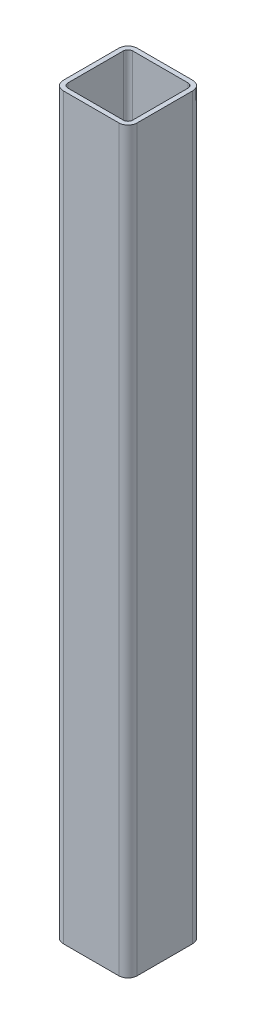
ISO-10303-21;
HEADER;
FILE_DESCRIPTION(('STEP AP214'),'2;1');
FILE_NAME('part.step','',(''),(''),'','','');
FILE_SCHEMA(('AUTOMOTIVE_DESIGN { 1 0 10303 214 1 1 1 1 }'));
ENDSEC;
DATA;
#1=APPLICATION_CONTEXT('core data for automotive mechanical design processes');
#2=APPLICATION_PROTOCOL_DEFINITION('international standard','automotive_design',2000,#1);
#3=PRODUCT_CONTEXT('',#1,'mechanical');
#4=PRODUCT('Part','Part','',(#3));
#5=PRODUCT_RELATED_PRODUCT_CATEGORY('part','',(#4));
#6=PRODUCT_DEFINITION_FORMATION('','',#4);
#7=PRODUCT_DEFINITION_CONTEXT('part definition',#1,'design');
#8=PRODUCT_DEFINITION('design','',#6,#7);
#9=PRODUCT_DEFINITION_SHAPE('','',#8);
#10=(LENGTH_UNIT() NAMED_UNIT(*) SI_UNIT(.MILLI.,.METRE.));
#11=(NAMED_UNIT(*) PLANE_ANGLE_UNIT() SI_UNIT($,.RADIAN.));
#12=(NAMED_UNIT(*) SI_UNIT($,.STERADIAN.) SOLID_ANGLE_UNIT());
#13=UNCERTAINTY_MEASURE_WITH_UNIT(LENGTH_MEASURE(1.E-05),#10,'distance_accuracy_value','');
#14=(GEOMETRIC_REPRESENTATION_CONTEXT(3) GLOBAL_UNCERTAINTY_ASSIGNED_CONTEXT((#13)) GLOBAL_UNIT_ASSIGNED_CONTEXT((#10,
#11,#12)) REPRESENTATION_CONTEXT('',''));
#15=CARTESIAN_POINT('',(0.,0.,0.));
#16=DIRECTION('',(0.,0.,1.));
#17=DIRECTION('',(1.,0.,0.));
#18=AXIS2_PLACEMENT_3D('',#15,#16,#17);
#19=CARTESIAN_POINT('',(-30.,800.,30.));
#20=DIRECTION('',(0.,-1.,0.));
#21=DIRECTION('',(0.,0.,-1.));
#22=AXIS2_PLACEMENT_3D('',#19,#20,#21);
#23=CYLINDRICAL_SURFACE('',#22,10.);
#24=CARTESIAN_POINT('',(-30.,0.,30.));
#25=DIRECTION('',(0.,1.,0.));
#26=DIRECTION('',(0.,0.,1.));
#27=AXIS2_PLACEMENT_3D('',#24,#25,#26);
#28=CIRCLE('',#27,10.);
#29=CARTESIAN_POINT('',(-40.,0.,30.));
#30=VERTEX_POINT('',#29);
#31=CARTESIAN_POINT('',(-30.,0.,40.));
#32=VERTEX_POINT('',#31);
#33=EDGE_CURVE('E239',#30,#32,#28,.T.);
#34=ORIENTED_EDGE('',*,*,#33,.T.);
#35=DIRECTION('',(0.,-1.,0.));
#36=VECTOR('',#35,1.);
#37=CARTESIAN_POINT('',(-30.,800.,40.));
#38=LINE('',#37,#36);
#39=CARTESIAN_POINT('',(-30.,800.,40.));
#40=VERTEX_POINT('',#39);
#41=EDGE_CURVE('E12',#40,#32,#38,.T.);
#42=ORIENTED_EDGE('',*,*,#41,.F.);
#43=CARTESIAN_POINT('',(-30.,800.,30.));
#44=DIRECTION('',(0.,1.,0.));
#45=DIRECTION('',(0.,0.,1.));
#46=AXIS2_PLACEMENT_3D('',#43,#44,#45);
#47=CIRCLE('',#46,10.);
#48=CARTESIAN_POINT('',(-40.,800.,30.));
#49=VERTEX_POINT('',#48);
#50=EDGE_CURVE('E320',#49,#40,#47,.T.);
#51=ORIENTED_EDGE('',*,*,#50,.F.);
#52=DIRECTION('',(0.,-1.,0.));
#53=VECTOR('',#52,1.);
#54=CARTESIAN_POINT('',(-40.,800.,30.));
#55=LINE('',#54,#53);
#56=EDGE_CURVE('E255',#49,#30,#55,.T.);
#57=ORIENTED_EDGE('',*,*,#56,.T.);
#58=EDGE_LOOP('',(#34,#42,#51,#57));
#59=FACE_BOUND('',#58,.T.);
#60=ADVANCED_FACE('F70',(#59),#23,.T.);
#61=CARTESIAN_POINT('',(-30.,800.,40.));
#62=DIRECTION('',(0.,0.,-1.));
#63=DIRECTION('',(-1.,0.,0.));
#64=AXIS2_PLACEMENT_3D('',#61,#62,#63);
#65=PLANE('',#64);
#66=DIRECTION('',(1.,0.,0.));
#67=VECTOR('',#66,1.);
#68=CARTESIAN_POINT('',(-30.,0.,40.));
#69=LINE('',#68,#67);
#70=CARTESIAN_POINT('',(30.,0.,40.));
#71=VERTEX_POINT('',#70);
#72=EDGE_CURVE('E245',#32,#71,#69,.T.);
#73=ORIENTED_EDGE('',*,*,#72,.T.);
#74=DIRECTION('',(0.,-1.,0.));
#75=VECTOR('',#74,1.);
#76=CARTESIAN_POINT('',(30.,800.,40.));
#77=LINE('',#76,#75);
#78=CARTESIAN_POINT('',(30.,800.,40.));
#79=VERTEX_POINT('',#78);
#80=EDGE_CURVE('E80',#79,#71,#77,.T.);
#81=ORIENTED_EDGE('',*,*,#80,.F.);
#82=DIRECTION('',(1.,0.,0.));
#83=VECTOR('',#82,1.);
#84=CARTESIAN_POINT('',(-30.,800.,40.));
#85=LINE('',#84,#83);
#86=EDGE_CURVE('E317',#40,#79,#85,.T.);
#87=ORIENTED_EDGE('',*,*,#86,.F.);
#88=ORIENTED_EDGE('',*,*,#41,.T.);
#89=EDGE_LOOP('',(#73,#81,#87,#88));
#90=FACE_BOUND('',#89,.T.);
#91=ADVANCED_FACE('F351',(#90),#65,.F.);
#92=CARTESIAN_POINT('',(30.,800.,30.));
#93=DIRECTION('',(0.,-1.,0.));
#94=DIRECTION('',(0.,0.,-1.));
#95=AXIS2_PLACEMENT_3D('',#92,#93,#94);
#96=CYLINDRICAL_SURFACE('',#95,10.);
#97=CARTESIAN_POINT('',(30.,0.,30.));
#98=DIRECTION('',(0.,1.,0.));
#99=DIRECTION('',(0.,0.,1.));
#100=AXIS2_PLACEMENT_3D('',#97,#98,#99);
#101=CIRCLE('',#100,10.);
#102=CARTESIAN_POINT('',(40.,0.,30.));
#103=VERTEX_POINT('',#102);
#104=EDGE_CURVE('E241',#71,#103,#101,.T.);
#105=ORIENTED_EDGE('',*,*,#104,.T.);
#106=DIRECTION('',(0.,-1.,0.));
#107=VECTOR('',#106,1.);
#108=CARTESIAN_POINT('',(40.,800.,30.));
#109=LINE('',#108,#107);
#110=CARTESIAN_POINT('',(40.,800.,30.));
#111=VERTEX_POINT('',#110);
#112=EDGE_CURVE('E261',#111,#103,#109,.T.);
#113=ORIENTED_EDGE('',*,*,#112,.F.);
#114=CARTESIAN_POINT('',(30.,800.,30.));
#115=DIRECTION('',(0.,1.,0.));
#116=DIRECTION('',(0.,0.,1.));
#117=AXIS2_PLACEMENT_3D('',#114,#115,#116);
#118=CIRCLE('',#117,10.);
#119=EDGE_CURVE('E321',#79,#111,#118,.T.);
#120=ORIENTED_EDGE('',*,*,#119,.F.);
#121=ORIENTED_EDGE('',*,*,#80,.T.);
#122=EDGE_LOOP('',(#105,#113,#120,#121));
#123=FACE_BOUND('',#122,.T.);
#124=ADVANCED_FACE('F358',(#123),#96,.T.);
#125=CARTESIAN_POINT('',(40.,800.,-30.));
#126=DIRECTION('',(-1.,0.,0.));
#127=DIRECTION('',(0.,0.,1.));
#128=AXIS2_PLACEMENT_3D('',#125,#126,#127);
#129=PLANE('',#128);
#130=DIRECTION('',(0.,0.,-1.));
#131=VECTOR('',#130,1.);
#132=CARTESIAN_POINT('',(40.,0.,-30.));
#133=LINE('',#132,#131);
#134=CARTESIAN_POINT('',(40.,0.,-30.));
#135=VERTEX_POINT('',#134);
#136=EDGE_CURVE('E246',#103,#135,#133,.T.);
#137=ORIENTED_EDGE('',*,*,#136,.T.);
#138=DIRECTION('',(0.,-1.,0.));
#139=VECTOR('',#138,1.);
#140=CARTESIAN_POINT('',(40.,800.,-30.));
#141=LINE('',#140,#139);
#142=CARTESIAN_POINT('',(40.,800.,-30.));
#143=VERTEX_POINT('',#142);
#144=EDGE_CURVE('E256',#143,#135,#141,.T.);
#145=ORIENTED_EDGE('',*,*,#144,.F.);
#146=DIRECTION('',(0.,0.,-1.));
#147=VECTOR('',#146,1.);
#148=CARTESIAN_POINT('',(40.,800.,-30.));
#149=LINE('',#148,#147);
#150=EDGE_CURVE('E323',#111,#143,#149,.T.);
#151=ORIENTED_EDGE('',*,*,#150,.F.);
#152=ORIENTED_EDGE('',*,*,#112,.T.);
#153=EDGE_LOOP('',(#137,#145,#151,#152));
#154=FACE_BOUND('',#153,.T.);
#155=ADVANCED_FACE('F328',(#154),#129,.F.);
#156=CARTESIAN_POINT('',(30.,800.,-30.));
#157=DIRECTION('',(0.,-1.,0.));
#158=DIRECTION('',(0.,0.,-1.));
#159=AXIS2_PLACEMENT_3D('',#156,#157,#158);
#160=CYLINDRICAL_SURFACE('',#159,10.);
#161=CARTESIAN_POINT('',(30.,0.,-30.));
#162=DIRECTION('',(0.,1.,0.));
#163=DIRECTION('',(0.,0.,1.));
#164=AXIS2_PLACEMENT_3D('',#161,#162,#163);
#165=CIRCLE('',#164,10.);
#166=CARTESIAN_POINT('',(30.,0.,-40.));
#167=VERTEX_POINT('',#166);
#168=EDGE_CURVE('E247',#135,#167,#165,.T.);
#169=ORIENTED_EDGE('',*,*,#168,.T.);
#170=DIRECTION('',(0.,-1.,0.));
#171=VECTOR('',#170,1.);
#172=CARTESIAN_POINT('',(30.,800.,-40.));
#173=LINE('',#172,#171);
#174=CARTESIAN_POINT('',(30.,800.,-40.));
#175=VERTEX_POINT('',#174);
#176=EDGE_CURVE('E206',#175,#167,#173,.T.);
#177=ORIENTED_EDGE('',*,*,#176,.F.);
#178=CARTESIAN_POINT('',(30.,800.,-30.));
#179=DIRECTION('',(0.,1.,0.));
#180=DIRECTION('',(0.,0.,1.));
#181=AXIS2_PLACEMENT_3D('',#178,#179,#180);
#182=CIRCLE('',#181,10.);
#183=EDGE_CURVE('E197',#143,#175,#182,.T.);
#184=ORIENTED_EDGE('',*,*,#183,.F.);
#185=ORIENTED_EDGE('',*,*,#144,.T.);
#186=EDGE_LOOP('',(#169,#177,#184,#185));
#187=FACE_BOUND('',#186,.T.);
#188=ADVANCED_FACE('F334',(#187),#160,.T.);
#189=CARTESIAN_POINT('',(30.,800.,-40.));
#190=DIRECTION('',(0.,0.,1.));
#191=DIRECTION('',(1.,0.,0.));
#192=AXIS2_PLACEMENT_3D('',#189,#190,#191);
#193=PLANE('',#192);
#194=DIRECTION('',(-1.,0.,0.));
#195=VECTOR('',#194,1.);
#196=CARTESIAN_POINT('',(30.,0.,-40.));
#197=LINE('',#196,#195);
#198=CARTESIAN_POINT('',(-30.,0.,-40.));
#199=VERTEX_POINT('',#198);
#200=EDGE_CURVE('E202',#167,#199,#197,.T.);
#201=ORIENTED_EDGE('',*,*,#200,.T.);
#202=DIRECTION('',(0.,-1.,0.));
#203=VECTOR('',#202,1.);
#204=CARTESIAN_POINT('',(-30.,800.,-40.));
#205=LINE('',#204,#203);
#206=CARTESIAN_POINT('',(-30.,800.,-40.));
#207=VERTEX_POINT('',#206);
#208=EDGE_CURVE('E205',#207,#199,#205,.T.);
#209=ORIENTED_EDGE('',*,*,#208,.F.);
#210=DIRECTION('',(-1.,0.,0.));
#211=VECTOR('',#210,1.);
#212=CARTESIAN_POINT('',(30.,800.,-40.));
#213=LINE('',#212,#211);
#214=EDGE_CURVE('E191',#175,#207,#213,.T.);
#215=ORIENTED_EDGE('',*,*,#214,.F.);
#216=ORIENTED_EDGE('',*,*,#176,.T.);
#217=EDGE_LOOP('',(#201,#209,#215,#216));
#218=FACE_BOUND('',#217,.T.);
#219=ADVANCED_FACE('F201',(#218),#193,.F.);
#220=CARTESIAN_POINT('',(-30.,800.,-30.));
#221=DIRECTION('',(0.,-1.,0.));
#222=DIRECTION('',(0.,0.,-1.));
#223=AXIS2_PLACEMENT_3D('',#220,#221,#222);
#224=CYLINDRICAL_SURFACE('',#223,10.);
#225=CARTESIAN_POINT('',(-30.,0.,-30.));
#226=DIRECTION('',(0.,1.,0.));
#227=DIRECTION('',(0.,0.,1.));
#228=AXIS2_PLACEMENT_3D('',#225,#226,#227);
#229=CIRCLE('',#228,10.);
#230=CARTESIAN_POINT('',(-40.,0.,-30.));
#231=VERTEX_POINT('',#230);
#232=EDGE_CURVE('E138',#199,#231,#229,.T.);
#233=ORIENTED_EDGE('',*,*,#232,.T.);
#234=DIRECTION('',(0.,-1.,0.));
#235=VECTOR('',#234,1.);
#236=CARTESIAN_POINT('',(-40.,800.,-30.));
#237=LINE('',#236,#235);
#238=CARTESIAN_POINT('',(-40.,800.,-30.));
#239=VERTEX_POINT('',#238);
#240=EDGE_CURVE('E210',#239,#231,#237,.T.);
#241=ORIENTED_EDGE('',*,*,#240,.F.);
#242=CARTESIAN_POINT('',(-30.,800.,-30.));
#243=DIRECTION('',(0.,1.,0.));
#244=DIRECTION('',(0.,0.,1.));
#245=AXIS2_PLACEMENT_3D('',#242,#243,#244);
#246=CIRCLE('',#245,10.);
#247=EDGE_CURVE('E194',#207,#239,#246,.T.);
#248=ORIENTED_EDGE('',*,*,#247,.F.);
#249=ORIENTED_EDGE('',*,*,#208,.T.);
#250=EDGE_LOOP('',(#233,#241,#248,#249));
#251=FACE_BOUND('',#250,.T.);
#252=ADVANCED_FACE('F207',(#251),#224,.T.);
#253=CARTESIAN_POINT('',(30.,800.,30.));
#254=DIRECTION('',(0.,-1.,0.));
#255=DIRECTION('',(0.,0.,-1.));
#256=AXIS2_PLACEMENT_3D('',#253,#254,#255);
#257=CYLINDRICAL_SURFACE('',#256,5.);
#258=CARTESIAN_POINT('',(30.,0.,30.));
#259=DIRECTION('',(0.,1.,0.));
#260=DIRECTION('',(0.,0.,1.));
#261=AXIS2_PLACEMENT_3D('',#258,#259,#260);
#262=CIRCLE('',#261,5.);
#263=CARTESIAN_POINT('',(30.,0.,35.));
#264=VERTEX_POINT('',#263);
#265=CARTESIAN_POINT('',(35.,0.,30.));
#266=VERTEX_POINT('',#265);
#267=EDGE_CURVE('E214',#264,#266,#262,.T.);
#268=ORIENTED_EDGE('',*,*,#267,.F.);
#269=DIRECTION('',(0.,-1.,0.));
#270=VECTOR('',#269,1.);
#271=CARTESIAN_POINT('',(30.,800.,35.));
#272=LINE('',#271,#270);
#273=CARTESIAN_POINT('',(30.,800.,35.));
#274=VERTEX_POINT('',#273);
#275=EDGE_CURVE('E72',#274,#264,#272,.T.);
#276=ORIENTED_EDGE('',*,*,#275,.F.);
#277=CARTESIAN_POINT('',(30.,800.,30.));
#278=DIRECTION('',(0.,1.,0.));
#279=DIRECTION('',(0.,0.,1.));
#280=AXIS2_PLACEMENT_3D('',#277,#278,#279);
#281=CIRCLE('',#280,5.);
#282=CARTESIAN_POINT('',(35.,800.,30.));
#283=VERTEX_POINT('',#282);
#284=EDGE_CURVE('E251',#274,#283,#281,.T.);
#285=ORIENTED_EDGE('',*,*,#284,.T.);
#286=DIRECTION('',(0.,-1.,0.));
#287=VECTOR('',#286,1.);
#288=CARTESIAN_POINT('',(35.,800.,30.));
#289=LINE('',#288,#287);
#290=EDGE_CURVE('E211',#283,#266,#289,.T.);
#291=ORIENTED_EDGE('',*,*,#290,.T.);
#292=EDGE_LOOP('',(#268,#276,#285,#291));
#293=FACE_BOUND('',#292,.T.);
#294=ADVANCED_FACE('F68',(#293),#257,.F.);
#295=CARTESIAN_POINT('',(-30.,800.,35.));
#296=DIRECTION('',(0.,0.,-1.));
#297=DIRECTION('',(-1.,0.,0.));
#298=AXIS2_PLACEMENT_3D('',#295,#296,#297);
#299=PLANE('',#298);
#300=DIRECTION('',(1.,0.,0.));
#301=VECTOR('',#300,1.);
#302=CARTESIAN_POINT('',(-30.,0.,35.));
#303=LINE('',#302,#301);
#304=CARTESIAN_POINT('',(-30.,0.,35.));
#305=VERTEX_POINT('',#304);
#306=EDGE_CURVE('E217',#305,#264,#303,.T.);
#307=ORIENTED_EDGE('',*,*,#306,.F.);
#308=DIRECTION('',(0.,-1.,0.));
#309=VECTOR('',#308,1.);
#310=CARTESIAN_POINT('',(-30.,800.,35.));
#311=LINE('',#310,#309);
#312=CARTESIAN_POINT('',(-30.,800.,35.));
#313=VERTEX_POINT('',#312);
#314=EDGE_CURVE('E277',#313,#305,#311,.T.);
#315=ORIENTED_EDGE('',*,*,#314,.F.);
#316=DIRECTION('',(1.,0.,0.));
#317=VECTOR('',#316,1.);
#318=CARTESIAN_POINT('',(-30.,800.,35.));
#319=LINE('',#318,#317);
#320=EDGE_CURVE('E283',#313,#274,#319,.T.);
#321=ORIENTED_EDGE('',*,*,#320,.T.);
#322=ORIENTED_EDGE('',*,*,#275,.T.);
#323=EDGE_LOOP('',(#307,#315,#321,#322));
#324=FACE_BOUND('',#323,.T.);
#325=ADVANCED_FACE('F284',(#324),#299,.T.);
#326=CARTESIAN_POINT('',(-30.,800.,30.));
#327=DIRECTION('',(0.,-1.,0.));
#328=DIRECTION('',(0.,0.,-1.));
#329=AXIS2_PLACEMENT_3D('',#326,#327,#328);
#330=CYLINDRICAL_SURFACE('',#329,5.);
#331=CARTESIAN_POINT('',(-30.,0.,30.));
#332=DIRECTION('',(0.,1.,0.));
#333=DIRECTION('',(0.,0.,1.));
#334=AXIS2_PLACEMENT_3D('',#331,#332,#333);
#335=CIRCLE('',#334,5.);
#336=CARTESIAN_POINT('',(-35.,0.,30.));
#337=VERTEX_POINT('',#336);
#338=EDGE_CURVE('E222',#337,#305,#335,.T.);
#339=ORIENTED_EDGE('',*,*,#338,.F.);
#340=DIRECTION('',(0.,-1.,0.));
#341=VECTOR('',#340,1.);
#342=CARTESIAN_POINT('',(-35.,800.,30.));
#343=LINE('',#342,#341);
#344=CARTESIAN_POINT('',(-35.,800.,30.));
#345=VERTEX_POINT('',#344);
#346=EDGE_CURVE('E274',#345,#337,#343,.T.);
#347=ORIENTED_EDGE('',*,*,#346,.F.);
#348=CARTESIAN_POINT('',(-30.,800.,30.));
#349=DIRECTION('',(0.,1.,0.));
#350=DIRECTION('',(0.,0.,1.));
#351=AXIS2_PLACEMENT_3D('',#348,#349,#350);
#352=CIRCLE('',#351,5.);
#353=EDGE_CURVE('E291',#345,#313,#352,.T.);
#354=ORIENTED_EDGE('',*,*,#353,.T.);
#355=ORIENTED_EDGE('',*,*,#314,.T.);
#356=EDGE_LOOP('',(#339,#347,#354,#355));
#357=FACE_BOUND('',#356,.T.);
#358=ADVANCED_FACE('F292',(#357),#330,.F.);
#359=CARTESIAN_POINT('',(-35.,800.,30.));
#360=DIRECTION('',(1.,0.,0.));
#361=DIRECTION('',(0.,0.,-1.));
#362=AXIS2_PLACEMENT_3D('',#359,#360,#361);
#363=PLANE('',#362);
#364=DIRECTION('',(0.,0.,1.));
#365=VECTOR('',#364,1.);
#366=CARTESIAN_POINT('',(-35.,0.,30.));
#367=LINE('',#366,#365);
#368=CARTESIAN_POINT('',(-35.,0.,-30.));
#369=VERTEX_POINT('',#368);
#370=EDGE_CURVE('E221',#369,#337,#367,.T.);
#371=ORIENTED_EDGE('',*,*,#370,.F.);
#372=DIRECTION('',(0.,-1.,0.));
#373=VECTOR('',#372,1.);
#374=CARTESIAN_POINT('',(-35.,800.,-30.));
#375=LINE('',#374,#373);
#376=CARTESIAN_POINT('',(-35.,800.,-30.));
#377=VERTEX_POINT('',#376);
#378=EDGE_CURVE('E272',#377,#369,#375,.T.);
#379=ORIENTED_EDGE('',*,*,#378,.F.);
#380=DIRECTION('',(0.,0.,1.));
#381=VECTOR('',#380,1.);
#382=CARTESIAN_POINT('',(-35.,800.,30.));
#383=LINE('',#382,#381);
#384=EDGE_CURVE('E296',#377,#345,#383,.T.);
#385=ORIENTED_EDGE('',*,*,#384,.T.);
#386=ORIENTED_EDGE('',*,*,#346,.T.);
#387=EDGE_LOOP('',(#371,#379,#385,#386));
#388=FACE_BOUND('',#387,.T.);
#389=ADVANCED_FACE('F305',(#388),#363,.T.);
#390=CARTESIAN_POINT('',(-30.,800.,-30.));
#391=DIRECTION('',(0.,-1.,0.));
#392=DIRECTION('',(0.,0.,-1.));
#393=AXIS2_PLACEMENT_3D('',#390,#391,#392);
#394=CYLINDRICAL_SURFACE('',#393,5.);
#395=CARTESIAN_POINT('',(-30.,0.,-30.));
#396=DIRECTION('',(0.,1.,0.));
#397=DIRECTION('',(0.,0.,1.));
#398=AXIS2_PLACEMENT_3D('',#395,#396,#397);
#399=CIRCLE('',#398,5.);
#400=CARTESIAN_POINT('',(-30.,0.,-35.));
#401=VERTEX_POINT('',#400);
#402=EDGE_CURVE('E230',#401,#369,#399,.T.);
#403=ORIENTED_EDGE('',*,*,#402,.F.);
#404=DIRECTION('',(0.,-1.,0.));
#405=VECTOR('',#404,1.);
#406=CARTESIAN_POINT('',(-30.,800.,-35.));
#407=LINE('',#406,#405);
#408=CARTESIAN_POINT('',(-30.,800.,-35.));
#409=VERTEX_POINT('',#408);
#410=EDGE_CURVE('E271',#409,#401,#407,.T.);
#411=ORIENTED_EDGE('',*,*,#410,.F.);
#412=CARTESIAN_POINT('',(-30.,800.,-30.));
#413=DIRECTION('',(0.,1.,0.));
#414=DIRECTION('',(0.,0.,1.));
#415=AXIS2_PLACEMENT_3D('',#412,#413,#414);
#416=CIRCLE('',#415,5.);
#417=EDGE_CURVE('E302',#409,#377,#416,.T.);
#418=ORIENTED_EDGE('',*,*,#417,.T.);
#419=ORIENTED_EDGE('',*,*,#378,.T.);
#420=EDGE_LOOP('',(#403,#411,#418,#419));
#421=FACE_BOUND('',#420,.T.);
#422=ADVANCED_FACE('F367',(#421),#394,.F.);
#423=CARTESIAN_POINT('',(30.,800.,-35.));
#424=DIRECTION('',(0.,0.,1.));
#425=DIRECTION('',(1.,0.,0.));
#426=AXIS2_PLACEMENT_3D('',#423,#424,#425);
#427=PLANE('',#426);
#428=DIRECTION('',(-1.,0.,0.));
#429=VECTOR('',#428,1.);
#430=CARTESIAN_POINT('',(30.,0.,-35.));
#431=LINE('',#430,#429);
#432=CARTESIAN_POINT('',(30.,0.,-35.));
#433=VERTEX_POINT('',#432);
#434=EDGE_CURVE('E228',#433,#401,#431,.T.);
#435=ORIENTED_EDGE('',*,*,#434,.F.);
#436=DIRECTION('',(0.,-1.,0.));
#437=VECTOR('',#436,1.);
#438=CARTESIAN_POINT('',(30.,800.,-35.));
#439=LINE('',#438,#437);
#440=CARTESIAN_POINT('',(30.,800.,-35.));
#441=VERTEX_POINT('',#440);
#442=EDGE_CURVE('E267',#441,#433,#439,.T.);
#443=ORIENTED_EDGE('',*,*,#442,.F.);
#444=DIRECTION('',(-1.,0.,0.));
#445=VECTOR('',#444,1.);
#446=CARTESIAN_POINT('',(30.,800.,-35.));
#447=LINE('',#446,#445);
#448=EDGE_CURVE('E304',#441,#409,#447,.T.);
#449=ORIENTED_EDGE('',*,*,#448,.T.);
#450=ORIENTED_EDGE('',*,*,#410,.T.);
#451=EDGE_LOOP('',(#435,#443,#449,#450));
#452=FACE_BOUND('',#451,.T.);
#453=ADVANCED_FACE('F368',(#452),#427,.T.);
#454=CARTESIAN_POINT('',(30.,800.,-30.));
#455=DIRECTION('',(0.,-1.,0.));
#456=DIRECTION('',(0.,0.,-1.));
#457=AXIS2_PLACEMENT_3D('',#454,#455,#456);
#458=CYLINDRICAL_SURFACE('',#457,5.);
#459=CARTESIAN_POINT('',(30.,0.,-30.));
#460=DIRECTION('',(0.,1.,0.));
#461=DIRECTION('',(0.,0.,1.));
#462=AXIS2_PLACEMENT_3D('',#459,#460,#461);
#463=CIRCLE('',#462,5.);
#464=CARTESIAN_POINT('',(35.,0.,-30.));
#465=VERTEX_POINT('',#464);
#466=EDGE_CURVE('E232',#465,#433,#463,.T.);
#467=ORIENTED_EDGE('',*,*,#466,.F.);
#468=DIRECTION('',(0.,-1.,0.));
#469=VECTOR('',#468,1.);
#470=CARTESIAN_POINT('',(35.,800.,-30.));
#471=LINE('',#470,#469);
#472=CARTESIAN_POINT('',(35.,800.,-30.));
#473=VERTEX_POINT('',#472);
#474=EDGE_CURVE('E270',#473,#465,#471,.T.);
#475=ORIENTED_EDGE('',*,*,#474,.F.);
#476=CARTESIAN_POINT('',(30.,800.,-30.));
#477=DIRECTION('',(0.,1.,0.));
#478=DIRECTION('',(0.,0.,1.));
#479=AXIS2_PLACEMENT_3D('',#476,#477,#478);
#480=CIRCLE('',#479,5.);
#481=EDGE_CURVE('E313',#473,#441,#480,.T.);
#482=ORIENTED_EDGE('',*,*,#481,.T.);
#483=ORIENTED_EDGE('',*,*,#442,.T.);
#484=EDGE_LOOP('',(#467,#475,#482,#483));
#485=FACE_BOUND('',#484,.T.);
#486=ADVANCED_FACE('F346',(#485),#458,.F.);
#487=CARTESIAN_POINT('',(35.,800.,-30.));
#488=DIRECTION('',(-1.,0.,0.));
#489=DIRECTION('',(0.,0.,1.));
#490=AXIS2_PLACEMENT_3D('',#487,#488,#489);
#491=PLANE('',#490);
#492=DIRECTION('',(0.,0.,-1.));
#493=VECTOR('',#492,1.);
#494=CARTESIAN_POINT('',(35.,0.,-30.));
#495=LINE('',#494,#493);
#496=EDGE_CURVE('E237',#266,#465,#495,.T.);
#497=ORIENTED_EDGE('',*,*,#496,.F.);
#498=ORIENTED_EDGE('',*,*,#290,.F.);
#499=DIRECTION('',(0.,0.,-1.));
#500=VECTOR('',#499,1.);
#501=CARTESIAN_POINT('',(35.,800.,-30.));
#502=LINE('',#501,#500);
#503=EDGE_CURVE('E314',#283,#473,#502,.T.);
#504=ORIENTED_EDGE('',*,*,#503,.T.);
#505=ORIENTED_EDGE('',*,*,#474,.T.);
#506=EDGE_LOOP('',(#497,#498,#504,#505));
#507=FACE_BOUND('',#506,.T.);
#508=ADVANCED_FACE('F341',(#507),#491,.T.);
#509=CARTESIAN_POINT('',(-40.,800.,30.));
#510=DIRECTION('',(1.,0.,0.));
#511=DIRECTION('',(0.,0.,-1.));
#512=AXIS2_PLACEMENT_3D('',#509,#510,#511);
#513=PLANE('',#512);
#514=DIRECTION('',(0.,0.,1.));
#515=VECTOR('',#514,1.);
#516=CARTESIAN_POINT('',(-40.,0.,30.));
#517=LINE('',#516,#515);
#518=EDGE_CURVE('E144',#231,#30,#517,.T.);
#519=ORIENTED_EDGE('',*,*,#518,.T.);
#520=ORIENTED_EDGE('',*,*,#56,.F.);
#521=DIRECTION('',(0.,0.,1.));
#522=VECTOR('',#521,1.);
#523=CARTESIAN_POINT('',(-40.,800.,30.));
#524=LINE('',#523,#522);
#525=EDGE_CURVE('E88',#239,#49,#524,.T.);
#526=ORIENTED_EDGE('',*,*,#525,.F.);
#527=ORIENTED_EDGE('',*,*,#240,.T.);
#528=EDGE_LOOP('',(#519,#520,#526,#527));
#529=FACE_BOUND('',#528,.T.);
#530=ADVANCED_FACE('F336',(#529),#513,.F.);
#531=CARTESIAN_POINT('',(-30.,800.,30.));
#532=DIRECTION('',(0.,1.,0.));
#533=DIRECTION('',(0.,0.,1.));
#534=AXIS2_PLACEMENT_3D('',#531,#532,#533);
#535=PLANE('',#534);
#536=ORIENTED_EDGE('',*,*,#284,.F.);
#537=ORIENTED_EDGE('',*,*,#320,.F.);
#538=ORIENTED_EDGE('',*,*,#353,.F.);
#539=ORIENTED_EDGE('',*,*,#384,.F.);
#540=ORIENTED_EDGE('',*,*,#417,.F.);
#541=ORIENTED_EDGE('',*,*,#448,.F.);
#542=ORIENTED_EDGE('',*,*,#481,.F.);
#543=ORIENTED_EDGE('',*,*,#503,.F.);
#544=EDGE_LOOP('',(#536,#537,#538,#539,#540,#541,#542,#543));
#545=FACE_BOUND('',#544,.T.);
#546=ORIENTED_EDGE('',*,*,#50,.T.);
#547=ORIENTED_EDGE('',*,*,#86,.T.);
#548=ORIENTED_EDGE('',*,*,#119,.T.);
#549=ORIENTED_EDGE('',*,*,#150,.T.);
#550=ORIENTED_EDGE('',*,*,#183,.T.);
#551=ORIENTED_EDGE('',*,*,#214,.T.);
#552=ORIENTED_EDGE('',*,*,#247,.T.);
#553=ORIENTED_EDGE('',*,*,#525,.T.);
#554=EDGE_LOOP('',(#546,#547,#548,#549,#550,#551,#552,#553));
#555=FACE_BOUND('',#554,.T.);
#556=ADVANCED_FACE('F192',(#545,#555),#535,.T.);
#557=CARTESIAN_POINT('',(-30.,0.,30.));
#558=DIRECTION('',(0.,1.,0.));
#559=DIRECTION('',(0.,0.,1.));
#560=AXIS2_PLACEMENT_3D('',#557,#558,#559);
#561=PLANE('',#560);
#562=ORIENTED_EDGE('',*,*,#267,.T.);
#563=ORIENTED_EDGE('',*,*,#496,.T.);
#564=ORIENTED_EDGE('',*,*,#466,.T.);
#565=ORIENTED_EDGE('',*,*,#434,.T.);
#566=ORIENTED_EDGE('',*,*,#402,.T.);
#567=ORIENTED_EDGE('',*,*,#370,.T.);
#568=ORIENTED_EDGE('',*,*,#338,.T.);
#569=ORIENTED_EDGE('',*,*,#306,.T.);
#570=EDGE_LOOP('',(#562,#563,#564,#565,#566,#567,#568,#569));
#571=FACE_BOUND('',#570,.T.);
#572=ORIENTED_EDGE('',*,*,#33,.F.);
#573=ORIENTED_EDGE('',*,*,#518,.F.);
#574=ORIENTED_EDGE('',*,*,#232,.F.);
#575=ORIENTED_EDGE('',*,*,#200,.F.);
#576=ORIENTED_EDGE('',*,*,#168,.F.);
#577=ORIENTED_EDGE('',*,*,#136,.F.);
#578=ORIENTED_EDGE('',*,*,#104,.F.);
#579=ORIENTED_EDGE('',*,*,#72,.F.);
#580=EDGE_LOOP('',(#572,#573,#574,#575,#576,#577,#578,#579));
#581=FACE_BOUND('',#580,.T.);
#582=ADVANCED_FACE('F287',(#571,#581),#561,.F.);
#583=CLOSED_SHELL('',(#60,#91,#124,#155,#188,#219,#252,#294,#325,#358,#389,#422,#453,#486,#508,
#530,#556,#582));
#584=MANIFOLD_SOLID_BREP('B2',#583);
#585=ADVANCED_BREP_SHAPE_REPRESENTATION('',(#18,#584),#14);
#586=SHAPE_DEFINITION_REPRESENTATION(#9,#585);
ENDSEC;
END-ISO-10303-21;
